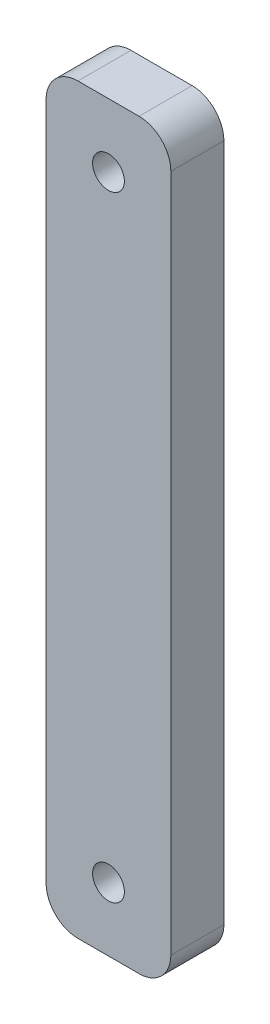
ISO-10303-21;
HEADER;
FILE_DESCRIPTION(('STEP AP214'),'2;1');
FILE_NAME('part.step','',(''),(''),'','','');
FILE_SCHEMA(('AUTOMOTIVE_DESIGN { 1 0 10303 214 1 1 1 1 }'));
ENDSEC;
DATA;
#1=APPLICATION_CONTEXT('core data for automotive mechanical design processes');
#2=APPLICATION_PROTOCOL_DEFINITION('international standard','automotive_design',2000,#1);
#3=PRODUCT_CONTEXT('',#1,'mechanical');
#4=PRODUCT('Part','Part','',(#3));
#5=PRODUCT_RELATED_PRODUCT_CATEGORY('part','',(#4));
#6=PRODUCT_DEFINITION_FORMATION('','',#4);
#7=PRODUCT_DEFINITION_CONTEXT('part definition',#1,'design');
#8=PRODUCT_DEFINITION('design','',#6,#7);
#9=PRODUCT_DEFINITION_SHAPE('','',#8);
#10=(LENGTH_UNIT() NAMED_UNIT(*) SI_UNIT(.MILLI.,.METRE.));
#11=(NAMED_UNIT(*) PLANE_ANGLE_UNIT() SI_UNIT($,.RADIAN.));
#12=(NAMED_UNIT(*) SI_UNIT($,.STERADIAN.) SOLID_ANGLE_UNIT());
#13=UNCERTAINTY_MEASURE_WITH_UNIT(LENGTH_MEASURE(1.E-05),#10,'distance_accuracy_value','');
#14=(GEOMETRIC_REPRESENTATION_CONTEXT(3) GLOBAL_UNCERTAINTY_ASSIGNED_CONTEXT((#13)) GLOBAL_UNIT_ASSIGNED_CONTEXT((#10,
#11,#12)) REPRESENTATION_CONTEXT('',''));
#15=CARTESIAN_POINT('',(0.,0.,0.));
#16=DIRECTION('',(0.,0.,1.));
#17=DIRECTION('',(1.,0.,0.));
#18=AXIS2_PLACEMENT_3D('',#15,#16,#17);
#19=CARTESIAN_POINT('',(-2.88,32.,5.));
#20=DIRECTION('',(0.,0.,1.));
#21=DIRECTION('',(1.,0.,0.));
#22=AXIS2_PLACEMENT_3D('',#19,#20,#21);
#23=PLANE('',#22);
#24=CARTESIAN_POINT('',(0.,-29.,5.));
#25=DIRECTION('',(0.,0.,1.));
#26=DIRECTION('',(1.,0.,0.));
#27=AXIS2_PLACEMENT_3D('',#24,#25,#26);
#28=CIRCLE('',#27,1.5);
#29=CARTESIAN_POINT('',(1.5,-29.,5.));
#30=VERTEX_POINT('',#29);
#31=EDGE_CURVE('E133',#30,#30,#28,.T.);
#32=ORIENTED_EDGE('',*,*,#31,.F.);
#33=EDGE_LOOP('',(#32));
#34=FACE_BOUND('',#33,.T.);
#35=CARTESIAN_POINT('',(-2.88,32.,5.));
#36=DIRECTION('',(0.,0.,1.));
#37=DIRECTION('',(1.,0.,0.));
#38=AXIS2_PLACEMENT_3D('',#35,#36,#37);
#39=CIRCLE('',#38,3.);
#40=CARTESIAN_POINT('',(-2.87999999999998,35.,5.));
#41=VERTEX_POINT('',#40);
#42=CARTESIAN_POINT('',(-5.88,32.,5.));
#43=VERTEX_POINT('',#42);
#44=EDGE_CURVE('E144',#41,#43,#39,.T.);
#45=ORIENTED_EDGE('',*,*,#44,.T.);
#46=DIRECTION('',(0.,-1.,0.));
#47=VECTOR('',#46,1.);
#48=CARTESIAN_POINT('',(-5.88,-32.,5.));
#49=LINE('',#48,#47);
#50=CARTESIAN_POINT('',(-5.88,-32.,5.));
#51=VERTEX_POINT('',#50);
#52=EDGE_CURVE('E92',#43,#51,#49,.T.);
#53=ORIENTED_EDGE('',*,*,#52,.T.);
#54=CARTESIAN_POINT('',(-2.88,-32.,5.));
#55=DIRECTION('',(0.,0.,1.));
#56=DIRECTION('',(-1.,0.,0.));
#57=AXIS2_PLACEMENT_3D('',#54,#55,#56);
#58=CIRCLE('',#57,3.);
#59=CARTESIAN_POINT('',(-2.87999999999998,-35.,5.));
#60=VERTEX_POINT('',#59);
#61=EDGE_CURVE('E159',#51,#60,#58,.T.);
#62=ORIENTED_EDGE('',*,*,#61,.T.);
#63=DIRECTION('',(1.,0.,0.));
#64=VECTOR('',#63,1.);
#65=CARTESIAN_POINT('',(2.87999999999998,-35.,5.));
#66=LINE('',#65,#64);
#67=CARTESIAN_POINT('',(2.87999999999998,-35.,5.));
#68=VERTEX_POINT('',#67);
#69=EDGE_CURVE('E172',#60,#68,#66,.T.);
#70=ORIENTED_EDGE('',*,*,#69,.T.);
#71=CARTESIAN_POINT('',(2.88,-32.,5.));
#72=DIRECTION('',(0.,0.,1.));
#73=DIRECTION('',(1.,0.,0.));
#74=AXIS2_PLACEMENT_3D('',#71,#72,#73);
#75=CIRCLE('',#74,3.);
#76=CARTESIAN_POINT('',(5.88,-32.,5.));
#77=VERTEX_POINT('',#76);
#78=EDGE_CURVE('E111',#68,#77,#75,.T.);
#79=ORIENTED_EDGE('',*,*,#78,.T.);
#80=DIRECTION('',(0.,1.,0.));
#81=VECTOR('',#80,1.);
#82=CARTESIAN_POINT('',(5.88,-32.,5.));
#83=LINE('',#82,#81);
#84=CARTESIAN_POINT('',(5.88,32.,5.));
#85=VERTEX_POINT('',#84);
#86=EDGE_CURVE('E105',#77,#85,#83,.T.);
#87=ORIENTED_EDGE('',*,*,#86,.T.);
#88=CARTESIAN_POINT('',(2.88,32.,5.));
#89=DIRECTION('',(0.,0.,1.));
#90=DIRECTION('',(1.,0.,0.));
#91=AXIS2_PLACEMENT_3D('',#88,#89,#90);
#92=CIRCLE('',#91,3.);
#93=CARTESIAN_POINT('',(2.87999999999998,35.,5.));
#94=VERTEX_POINT('',#93);
#95=EDGE_CURVE('E109',#85,#94,#92,.T.);
#96=ORIENTED_EDGE('',*,*,#95,.T.);
#97=DIRECTION('',(-1.,0.,0.));
#98=VECTOR('',#97,1.);
#99=CARTESIAN_POINT('',(2.87999999999998,35.,5.));
#100=LINE('',#99,#98);
#101=EDGE_CURVE('E49',#94,#41,#100,.T.);
#102=ORIENTED_EDGE('',*,*,#101,.T.);
#103=EDGE_LOOP('',(#45,#53,#62,#70,#79,#87,#96,#102));
#104=FACE_BOUND('',#103,.T.);
#105=CARTESIAN_POINT('',(0.,29.,5.));
#106=DIRECTION('',(0.,0.,1.));
#107=DIRECTION('',(1.,0.,0.));
#108=AXIS2_PLACEMENT_3D('',#105,#106,#107);
#109=CIRCLE('',#108,1.5);
#110=CARTESIAN_POINT('',(1.5,29.,5.));
#111=VERTEX_POINT('',#110);
#112=EDGE_CURVE('E181',#111,#111,#109,.T.);
#113=ORIENTED_EDGE('',*,*,#112,.F.);
#114=EDGE_LOOP('',(#113));
#115=FACE_BOUND('',#114,.T.);
#116=ADVANCED_FACE('F32',(#34,#104,#115),#23,.T.);
#117=CARTESIAN_POINT('',(-2.88,32.,0.));
#118=DIRECTION('',(0.,0.,1.));
#119=DIRECTION('',(1.,0.,0.));
#120=AXIS2_PLACEMENT_3D('',#117,#118,#119);
#121=PLANE('',#120);
#122=CARTESIAN_POINT('',(-2.88,32.,0.));
#123=DIRECTION('',(0.,0.,1.));
#124=DIRECTION('',(1.,0.,0.));
#125=AXIS2_PLACEMENT_3D('',#122,#123,#124);
#126=CIRCLE('',#125,3.);
#127=CARTESIAN_POINT('',(-2.87999999999998,35.,0.));
#128=VERTEX_POINT('',#127);
#129=CARTESIAN_POINT('',(-5.88,32.,0.));
#130=VERTEX_POINT('',#129);
#131=EDGE_CURVE('E129',#128,#130,#126,.T.);
#132=ORIENTED_EDGE('',*,*,#131,.F.);
#133=DIRECTION('',(-1.,0.,0.));
#134=VECTOR('',#133,1.);
#135=CARTESIAN_POINT('',(2.87999999999998,35.,0.));
#136=LINE('',#135,#134);
#137=CARTESIAN_POINT('',(2.87999999999998,35.,0.));
#138=VERTEX_POINT('',#137);
#139=EDGE_CURVE('E84',#138,#128,#136,.T.);
#140=ORIENTED_EDGE('',*,*,#139,.F.);
#141=CARTESIAN_POINT('',(2.88,32.,0.));
#142=DIRECTION('',(0.,0.,1.));
#143=DIRECTION('',(1.,0.,0.));
#144=AXIS2_PLACEMENT_3D('',#141,#142,#143);
#145=CIRCLE('',#144,3.);
#146=CARTESIAN_POINT('',(5.88,32.,0.));
#147=VERTEX_POINT('',#146);
#148=EDGE_CURVE('E78',#147,#138,#145,.T.);
#149=ORIENTED_EDGE('',*,*,#148,.F.);
#150=DIRECTION('',(0.,1.,0.));
#151=VECTOR('',#150,1.);
#152=CARTESIAN_POINT('',(5.88,-32.,0.));
#153=LINE('',#152,#151);
#154=CARTESIAN_POINT('',(5.88,-32.,0.));
#155=VERTEX_POINT('',#154);
#156=EDGE_CURVE('E119',#155,#147,#153,.T.);
#157=ORIENTED_EDGE('',*,*,#156,.F.);
#158=CARTESIAN_POINT('',(2.88,-32.,0.));
#159=DIRECTION('',(0.,0.,1.));
#160=DIRECTION('',(1.,0.,0.));
#161=AXIS2_PLACEMENT_3D('',#158,#159,#160);
#162=CIRCLE('',#161,3.);
#163=CARTESIAN_POINT('',(2.87999999999998,-35.,0.));
#164=VERTEX_POINT('',#163);
#165=EDGE_CURVE('E139',#164,#155,#162,.T.);
#166=ORIENTED_EDGE('',*,*,#165,.F.);
#167=DIRECTION('',(1.,0.,0.));
#168=VECTOR('',#167,1.);
#169=CARTESIAN_POINT('',(2.87999999999998,-35.,0.));
#170=LINE('',#169,#168);
#171=CARTESIAN_POINT('',(-2.87999999999998,-35.,0.));
#172=VERTEX_POINT('',#171);
#173=EDGE_CURVE('E137',#172,#164,#170,.T.);
#174=ORIENTED_EDGE('',*,*,#173,.F.);
#175=CARTESIAN_POINT('',(-2.88,-32.,0.));
#176=DIRECTION('',(0.,0.,1.));
#177=DIRECTION('',(-1.,0.,0.));
#178=AXIS2_PLACEMENT_3D('',#175,#176,#177);
#179=CIRCLE('',#178,3.);
#180=CARTESIAN_POINT('',(-5.88,-32.,0.));
#181=VERTEX_POINT('',#180);
#182=EDGE_CURVE('E135',#181,#172,#179,.T.);
#183=ORIENTED_EDGE('',*,*,#182,.F.);
#184=DIRECTION('',(0.,-1.,0.));
#185=VECTOR('',#184,1.);
#186=CARTESIAN_POINT('',(-5.88,-32.,0.));
#187=LINE('',#186,#185);
#188=EDGE_CURVE('E132',#130,#181,#187,.T.);
#189=ORIENTED_EDGE('',*,*,#188,.F.);
#190=EDGE_LOOP('',(#132,#140,#149,#157,#166,#174,#183,#189));
#191=FACE_BOUND('',#190,.T.);
#192=CARTESIAN_POINT('',(0.,-29.,0.));
#193=DIRECTION('',(0.,0.,1.));
#194=DIRECTION('',(1.,0.,0.));
#195=AXIS2_PLACEMENT_3D('',#192,#193,#194);
#196=CIRCLE('',#195,1.5);
#197=CARTESIAN_POINT('',(1.5,-29.,0.));
#198=VERTEX_POINT('',#197);
#199=EDGE_CURVE('E178',#198,#198,#196,.T.);
#200=ORIENTED_EDGE('',*,*,#199,.T.);
#201=EDGE_LOOP('',(#200));
#202=FACE_BOUND('',#201,.T.);
#203=CARTESIAN_POINT('',(0.,29.,0.));
#204=DIRECTION('',(0.,0.,1.));
#205=DIRECTION('',(1.,0.,0.));
#206=AXIS2_PLACEMENT_3D('',#203,#204,#205);
#207=CIRCLE('',#206,1.5);
#208=CARTESIAN_POINT('',(1.5,29.,0.));
#209=VERTEX_POINT('',#208);
#210=EDGE_CURVE('E184',#209,#209,#207,.T.);
#211=ORIENTED_EDGE('',*,*,#210,.T.);
#212=EDGE_LOOP('',(#211));
#213=FACE_BOUND('',#212,.T.);
#214=ADVANCED_FACE('F163',(#191,#202,#213),#121,.F.);
#215=CARTESIAN_POINT('',(-2.88,32.,5.));
#216=DIRECTION('',(0.,0.,-1.));
#217=DIRECTION('',(-1.,0.,0.));
#218=AXIS2_PLACEMENT_3D('',#215,#216,#217);
#219=CYLINDRICAL_SURFACE('',#218,3.);
#220=ORIENTED_EDGE('',*,*,#131,.T.);
#221=DIRECTION('',(0.,0.,-1.));
#222=VECTOR('',#221,1.);
#223=CARTESIAN_POINT('',(-5.88,32.,5.));
#224=LINE('',#223,#222);
#225=EDGE_CURVE('E11',#43,#130,#224,.T.);
#226=ORIENTED_EDGE('',*,*,#225,.F.);
#227=ORIENTED_EDGE('',*,*,#44,.F.);
#228=DIRECTION('',(0.,0.,-1.));
#229=VECTOR('',#228,1.);
#230=CARTESIAN_POINT('',(-2.87999999999998,35.,5.));
#231=LINE('',#230,#229);
#232=EDGE_CURVE('E125',#41,#128,#231,.T.);
#233=ORIENTED_EDGE('',*,*,#232,.T.);
#234=EDGE_LOOP('',(#220,#226,#227,#233));
#235=FACE_BOUND('',#234,.T.);
#236=ADVANCED_FACE('F34',(#235),#219,.T.);
#237=CARTESIAN_POINT('',(-5.88,-32.,5.));
#238=DIRECTION('',(1.,0.,0.));
#239=DIRECTION('',(0.,0.,-1.));
#240=AXIS2_PLACEMENT_3D('',#237,#238,#239);
#241=PLANE('',#240);
#242=ORIENTED_EDGE('',*,*,#188,.T.);
#243=DIRECTION('',(0.,0.,-1.));
#244=VECTOR('',#243,1.);
#245=CARTESIAN_POINT('',(-5.88,-32.,5.));
#246=LINE('',#245,#244);
#247=EDGE_CURVE('E41',#51,#181,#246,.T.);
#248=ORIENTED_EDGE('',*,*,#247,.F.);
#249=ORIENTED_EDGE('',*,*,#52,.F.);
#250=ORIENTED_EDGE('',*,*,#225,.T.);
#251=EDGE_LOOP('',(#242,#248,#249,#250));
#252=FACE_BOUND('',#251,.T.);
#253=ADVANCED_FACE('F216',(#252),#241,.F.);
#254=CARTESIAN_POINT('',(-2.88,-32.,5.));
#255=DIRECTION('',(0.,0.,-1.));
#256=DIRECTION('',(-1.,0.,0.));
#257=AXIS2_PLACEMENT_3D('',#254,#255,#256);
#258=CYLINDRICAL_SURFACE('',#257,3.);
#259=ORIENTED_EDGE('',*,*,#182,.T.);
#260=DIRECTION('',(0.,0.,-1.));
#261=VECTOR('',#260,1.);
#262=CARTESIAN_POINT('',(-2.87999999999998,-35.,5.));
#263=LINE('',#262,#261);
#264=EDGE_CURVE('E151',#60,#172,#263,.T.);
#265=ORIENTED_EDGE('',*,*,#264,.F.);
#266=ORIENTED_EDGE('',*,*,#61,.F.);
#267=ORIENTED_EDGE('',*,*,#247,.T.);
#268=EDGE_LOOP('',(#259,#265,#266,#267));
#269=FACE_BOUND('',#268,.T.);
#270=ADVANCED_FACE('F157',(#269),#258,.T.);
#271=CARTESIAN_POINT('',(2.87999999999998,-35.,5.));
#272=DIRECTION('',(0.,1.,0.));
#273=DIRECTION('',(-1.,0.,0.));
#274=AXIS2_PLACEMENT_3D('',#271,#272,#273);
#275=PLANE('',#274);
#276=ORIENTED_EDGE('',*,*,#173,.T.);
#277=DIRECTION('',(0.,0.,-1.));
#278=VECTOR('',#277,1.);
#279=CARTESIAN_POINT('',(2.87999999999998,-35.,5.));
#280=LINE('',#279,#278);
#281=EDGE_CURVE('E148',#68,#164,#280,.T.);
#282=ORIENTED_EDGE('',*,*,#281,.F.);
#283=ORIENTED_EDGE('',*,*,#69,.F.);
#284=ORIENTED_EDGE('',*,*,#264,.T.);
#285=EDGE_LOOP('',(#276,#282,#283,#284));
#286=FACE_BOUND('',#285,.T.);
#287=ADVANCED_FACE('F168',(#286),#275,.F.);
#288=CARTESIAN_POINT('',(2.88,-32.,5.));
#289=DIRECTION('',(0.,0.,-1.));
#290=DIRECTION('',(-1.,0.,0.));
#291=AXIS2_PLACEMENT_3D('',#288,#289,#290);
#292=CYLINDRICAL_SURFACE('',#291,3.);
#293=ORIENTED_EDGE('',*,*,#165,.T.);
#294=DIRECTION('',(0.,0.,-1.));
#295=VECTOR('',#294,1.);
#296=CARTESIAN_POINT('',(5.88,-32.,5.));
#297=LINE('',#296,#295);
#298=EDGE_CURVE('E120',#77,#155,#297,.T.);
#299=ORIENTED_EDGE('',*,*,#298,.F.);
#300=ORIENTED_EDGE('',*,*,#78,.F.);
#301=ORIENTED_EDGE('',*,*,#281,.T.);
#302=EDGE_LOOP('',(#293,#299,#300,#301));
#303=FACE_BOUND('',#302,.T.);
#304=ADVANCED_FACE('F171',(#303),#292,.T.);
#305=CARTESIAN_POINT('',(5.88,-32.,5.));
#306=DIRECTION('',(-1.,0.,0.));
#307=DIRECTION('',(0.,0.,1.));
#308=AXIS2_PLACEMENT_3D('',#305,#306,#307);
#309=PLANE('',#308);
#310=ORIENTED_EDGE('',*,*,#156,.T.);
#311=DIRECTION('',(0.,0.,-1.));
#312=VECTOR('',#311,1.);
#313=CARTESIAN_POINT('',(5.88,32.,5.));
#314=LINE('',#313,#312);
#315=EDGE_CURVE('E116',#85,#147,#314,.T.);
#316=ORIENTED_EDGE('',*,*,#315,.F.);
#317=ORIENTED_EDGE('',*,*,#86,.F.);
#318=ORIENTED_EDGE('',*,*,#298,.T.);
#319=EDGE_LOOP('',(#310,#316,#317,#318));
#320=FACE_BOUND('',#319,.T.);
#321=ADVANCED_FACE('F117',(#320),#309,.F.);
#322=CARTESIAN_POINT('',(2.88,32.,5.));
#323=DIRECTION('',(0.,0.,-1.));
#324=DIRECTION('',(-1.,0.,0.));
#325=AXIS2_PLACEMENT_3D('',#322,#323,#324);
#326=CYLINDRICAL_SURFACE('',#325,3.);
#327=ORIENTED_EDGE('',*,*,#148,.T.);
#328=DIRECTION('',(0.,0.,-1.));
#329=VECTOR('',#328,1.);
#330=CARTESIAN_POINT('',(2.87999999999998,35.,5.));
#331=LINE('',#330,#329);
#332=EDGE_CURVE('E121',#94,#138,#331,.T.);
#333=ORIENTED_EDGE('',*,*,#332,.F.);
#334=ORIENTED_EDGE('',*,*,#95,.F.);
#335=ORIENTED_EDGE('',*,*,#315,.T.);
#336=EDGE_LOOP('',(#327,#333,#334,#335));
#337=FACE_BOUND('',#336,.T.);
#338=ADVANCED_FACE('F123',(#337),#326,.T.);
#339=CARTESIAN_POINT('',(2.87999999999998,35.,5.));
#340=DIRECTION('',(0.,-1.,0.));
#341=DIRECTION('',(1.,0.,0.));
#342=AXIS2_PLACEMENT_3D('',#339,#340,#341);
#343=PLANE('',#342);
#344=ORIENTED_EDGE('',*,*,#139,.T.);
#345=ORIENTED_EDGE('',*,*,#232,.F.);
#346=ORIENTED_EDGE('',*,*,#101,.F.);
#347=ORIENTED_EDGE('',*,*,#332,.T.);
#348=EDGE_LOOP('',(#344,#345,#346,#347));
#349=FACE_BOUND('',#348,.T.);
#350=ADVANCED_FACE('F204',(#349),#343,.F.);
#351=CARTESIAN_POINT('',(0.,-29.,5.));
#352=DIRECTION('',(0.,0.,-1.));
#353=DIRECTION('',(-1.,0.,0.));
#354=AXIS2_PLACEMENT_3D('',#351,#352,#353);
#355=CYLINDRICAL_SURFACE('',#354,1.5);
#356=ORIENTED_EDGE('',*,*,#31,.T.);
#357=EDGE_LOOP('',(#356));
#358=FACE_BOUND('',#357,.T.);
#359=ORIENTED_EDGE('',*,*,#199,.F.);
#360=EDGE_LOOP('',(#359));
#361=FACE_BOUND('',#360,.T.);
#362=ADVANCED_FACE('F201',(#358,#361),#355,.F.);
#363=CARTESIAN_POINT('',(0.,29.,5.));
#364=DIRECTION('',(0.,0.,-1.));
#365=DIRECTION('',(-1.,0.,0.));
#366=AXIS2_PLACEMENT_3D('',#363,#364,#365);
#367=CYLINDRICAL_SURFACE('',#366,1.5);
#368=ORIENTED_EDGE('',*,*,#112,.T.);
#369=EDGE_LOOP('',(#368));
#370=FACE_BOUND('',#369,.T.);
#371=ORIENTED_EDGE('',*,*,#210,.F.);
#372=EDGE_LOOP('',(#371));
#373=FACE_BOUND('',#372,.T.);
#374=ADVANCED_FACE('F190',(#370,#373),#367,.F.);
#375=CLOSED_SHELL('',(#116,#214,#236,#253,#270,#287,#304,#321,#338,#350,#362,#374));
#376=MANIFOLD_SOLID_BREP('B2',#375);
#377=ADVANCED_BREP_SHAPE_REPRESENTATION('',(#18,#376),#14);
#378=SHAPE_DEFINITION_REPRESENTATION(#9,#377);
ENDSEC;
END-ISO-10303-21;
